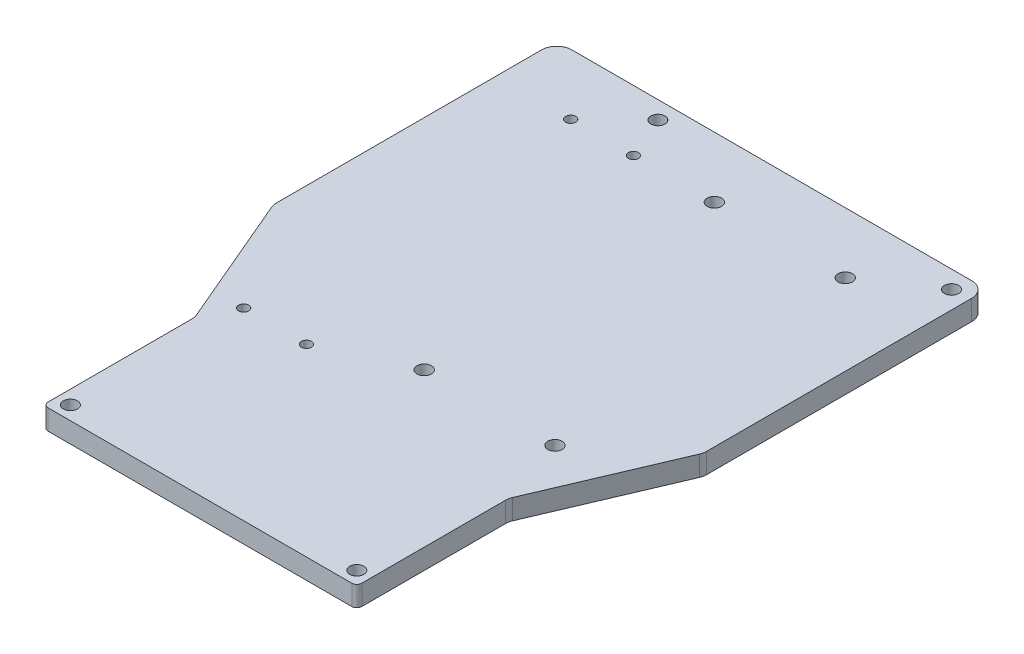
ISO-10303-21;
HEADER;
FILE_DESCRIPTION(('STEP AP214'),'2;1');
FILE_NAME('part.step','',(''),(''),'','','');
FILE_SCHEMA(('AUTOMOTIVE_DESIGN { 1 0 10303 214 1 1 1 1 }'));
ENDSEC;
DATA;
#1=APPLICATION_CONTEXT('core data for automotive mechanical design processes');
#2=APPLICATION_PROTOCOL_DEFINITION('international standard','automotive_design',2000,#1);
#3=PRODUCT_CONTEXT('',#1,'mechanical');
#4=PRODUCT('Part','Part','',(#3));
#5=PRODUCT_RELATED_PRODUCT_CATEGORY('part','',(#4));
#6=PRODUCT_DEFINITION_FORMATION('','',#4);
#7=PRODUCT_DEFINITION_CONTEXT('part definition',#1,'design');
#8=PRODUCT_DEFINITION('design','',#6,#7);
#9=PRODUCT_DEFINITION_SHAPE('','',#8);
#10=(LENGTH_UNIT() NAMED_UNIT(*) SI_UNIT(.MILLI.,.METRE.));
#11=(NAMED_UNIT(*) PLANE_ANGLE_UNIT() SI_UNIT($,.RADIAN.));
#12=(NAMED_UNIT(*) SI_UNIT($,.STERADIAN.) SOLID_ANGLE_UNIT());
#13=UNCERTAINTY_MEASURE_WITH_UNIT(LENGTH_MEASURE(1.E-05),#10,'distance_accuracy_value','');
#14=(GEOMETRIC_REPRESENTATION_CONTEXT(3) GLOBAL_UNCERTAINTY_ASSIGNED_CONTEXT((#13)) GLOBAL_UNIT_ASSIGNED_CONTEXT((#10,
#11,#12)) REPRESENTATION_CONTEXT('',''));
#15=CARTESIAN_POINT('',(0.,0.,0.));
#16=DIRECTION('',(0.,0.,1.));
#17=DIRECTION('',(1.,0.,0.));
#18=AXIS2_PLACEMENT_3D('',#15,#16,#17);
#19=CARTESIAN_POINT('',(39.5,4.,-25.));
#20=DIRECTION('',(0.,-1.,0.));
#21=DIRECTION('',(0.,0.,-1.));
#22=AXIS2_PLACEMENT_3D('',#19,#20,#21);
#23=CYLINDRICAL_SURFACE('',#22,3.);
#24=CARTESIAN_POINT('',(39.5,0.,-25.));
#25=DIRECTION('',(0.,1.,0.));
#26=DIRECTION('',(0.,0.,-1.));
#27=AXIS2_PLACEMENT_3D('',#24,#25,#26);
#28=CIRCLE('',#27,3.);
#29=CARTESIAN_POINT('',(42.5,0.,-25.));
#30=VERTEX_POINT('',#29);
#31=CARTESIAN_POINT('',(39.5,0.,-28.));
#32=VERTEX_POINT('',#31);
#33=EDGE_CURVE('E190',#30,#32,#28,.T.);
#34=ORIENTED_EDGE('',*,*,#33,.T.);
#35=DIRECTION('',(0.,-1.,0.));
#36=VECTOR('',#35,1.);
#37=CARTESIAN_POINT('',(39.5,4.,-28.));
#38=LINE('',#37,#36);
#39=CARTESIAN_POINT('',(39.5,4.,-28.));
#40=VERTEX_POINT('',#39);
#41=EDGE_CURVE('E11',#40,#32,#38,.T.);
#42=ORIENTED_EDGE('',*,*,#41,.F.);
#43=CARTESIAN_POINT('',(39.5,4.,-25.));
#44=DIRECTION('',(0.,1.,0.));
#45=DIRECTION('',(0.,0.,-1.));
#46=AXIS2_PLACEMENT_3D('',#43,#44,#45);
#47=CIRCLE('',#46,3.);
#48=CARTESIAN_POINT('',(42.5,4.,-25.));
#49=VERTEX_POINT('',#48);
#50=EDGE_CURVE('E237',#49,#40,#47,.T.);
#51=ORIENTED_EDGE('',*,*,#50,.F.);
#52=DIRECTION('',(0.,-1.,0.));
#53=VECTOR('',#52,1.);
#54=CARTESIAN_POINT('',(42.5,4.,-25.));
#55=LINE('',#54,#53);
#56=EDGE_CURVE('E186',#49,#30,#55,.T.);
#57=ORIENTED_EDGE('',*,*,#56,.T.);
#58=EDGE_LOOP('',(#34,#42,#51,#57));
#59=FACE_BOUND('',#58,.T.);
#60=ADVANCED_FACE('F41',(#59),#23,.T.);
#61=CARTESIAN_POINT('',(-39.5,4.,-28.));
#62=DIRECTION('',(0.,0.,1.));
#63=DIRECTION('',(1.,0.,0.));
#64=AXIS2_PLACEMENT_3D('',#61,#62,#63);
#65=PLANE('',#64);
#66=DIRECTION('',(-1.,0.,0.));
#67=VECTOR('',#66,1.);
#68=CARTESIAN_POINT('',(-39.5,0.,-28.));
#69=LINE('',#68,#67);
#70=CARTESIAN_POINT('',(-39.5,0.,-28.));
#71=VERTEX_POINT('',#70);
#72=EDGE_CURVE('E194',#32,#71,#69,.T.);
#73=ORIENTED_EDGE('',*,*,#72,.T.);
#74=DIRECTION('',(0.,-1.,0.));
#75=VECTOR('',#74,1.);
#76=CARTESIAN_POINT('',(-39.5,4.,-28.));
#77=LINE('',#76,#75);
#78=CARTESIAN_POINT('',(-39.5,4.,-28.));
#79=VERTEX_POINT('',#78);
#80=EDGE_CURVE('E50',#79,#71,#77,.T.);
#81=ORIENTED_EDGE('',*,*,#80,.F.);
#82=DIRECTION('',(-1.,0.,0.));
#83=VECTOR('',#82,1.);
#84=CARTESIAN_POINT('',(-39.5,4.,-28.));
#85=LINE('',#84,#83);
#86=EDGE_CURVE('E125',#40,#79,#85,.T.);
#87=ORIENTED_EDGE('',*,*,#86,.F.);
#88=ORIENTED_EDGE('',*,*,#41,.T.);
#89=EDGE_LOOP('',(#73,#81,#87,#88));
#90=FACE_BOUND('',#89,.T.);
#91=ADVANCED_FACE('F360',(#90),#65,.F.);
#92=CARTESIAN_POINT('',(-39.5,4.,-25.));
#93=DIRECTION('',(0.,-1.,0.));
#94=DIRECTION('',(0.,0.,-1.));
#95=AXIS2_PLACEMENT_3D('',#92,#93,#94);
#96=CYLINDRICAL_SURFACE('',#95,3.);
#97=CARTESIAN_POINT('',(-39.5,0.,-25.));
#98=DIRECTION('',(0.,1.,0.));
#99=DIRECTION('',(0.,0.,-1.));
#100=AXIS2_PLACEMENT_3D('',#97,#98,#99);
#101=CIRCLE('',#100,3.);
#102=CARTESIAN_POINT('',(-42.5,0.,-25.));
#103=VERTEX_POINT('',#102);
#104=EDGE_CURVE('E198',#71,#103,#101,.T.);
#105=ORIENTED_EDGE('',*,*,#104,.T.);
#106=DIRECTION('',(0.,-1.,0.));
#107=VECTOR('',#106,1.);
#108=CARTESIAN_POINT('',(-42.5,4.,-25.));
#109=LINE('',#108,#107);
#110=CARTESIAN_POINT('',(-42.5,4.,-25.));
#111=VERTEX_POINT('',#110);
#112=EDGE_CURVE('E280',#111,#103,#109,.T.);
#113=ORIENTED_EDGE('',*,*,#112,.F.);
#114=CARTESIAN_POINT('',(-39.5,4.,-25.));
#115=DIRECTION('',(0.,1.,0.));
#116=DIRECTION('',(0.,0.,-1.));
#117=AXIS2_PLACEMENT_3D('',#114,#115,#116);
#118=CIRCLE('',#117,3.);
#119=EDGE_CURVE('E290',#79,#111,#118,.T.);
#120=ORIENTED_EDGE('',*,*,#119,.F.);
#121=ORIENTED_EDGE('',*,*,#80,.T.);
#122=EDGE_LOOP('',(#105,#113,#120,#121));
#123=FACE_BOUND('',#122,.T.);
#124=ADVANCED_FACE('F288',(#123),#96,.T.);
#125=CARTESIAN_POINT('',(-42.5,4.,27.3877231700022));
#126=DIRECTION('',(1.,0.,0.));
#127=DIRECTION('',(0.,0.,-1.));
#128=AXIS2_PLACEMENT_3D('',#125,#126,#127);
#129=PLANE('',#128);
#130=DIRECTION('',(0.,0.,1.));
#131=VECTOR('',#130,1.);
#132=CARTESIAN_POINT('',(-42.5,0.,27.3877231700022));
#133=LINE('',#132,#131);
#134=CARTESIAN_POINT('',(-42.5,0.,27.3877231700022));
#135=VERTEX_POINT('',#134);
#136=EDGE_CURVE('E201',#103,#135,#133,.T.);
#137=ORIENTED_EDGE('',*,*,#136,.T.);
#138=DIRECTION('',(0.,-1.,0.));
#139=VECTOR('',#138,1.);
#140=CARTESIAN_POINT('',(-42.5,4.,27.3877231700022));
#141=LINE('',#140,#139);
#142=CARTESIAN_POINT('',(-42.5,4.,27.3877231700022));
#143=VERTEX_POINT('',#142);
#144=EDGE_CURVE('E276',#143,#135,#141,.T.);
#145=ORIENTED_EDGE('',*,*,#144,.F.);
#146=DIRECTION('',(0.,0.,1.));
#147=VECTOR('',#146,1.);
#148=CARTESIAN_POINT('',(-42.5,4.,27.3877231700022));
#149=LINE('',#148,#147);
#150=EDGE_CURVE('E309',#111,#143,#149,.T.);
#151=ORIENTED_EDGE('',*,*,#150,.F.);
#152=ORIENTED_EDGE('',*,*,#112,.T.);
#153=EDGE_LOOP('',(#137,#145,#151,#152));
#154=FACE_BOUND('',#153,.T.);
#155=ADVANCED_FACE('F299',(#154),#129,.F.);
#156=CARTESIAN_POINT('',(-39.5,4.,27.3877231700022));
#157=DIRECTION('',(0.,-1.,0.));
#158=DIRECTION('',(0.,0.,-1.));
#159=AXIS2_PLACEMENT_3D('',#156,#157,#158);
#160=CYLINDRICAL_SURFACE('',#159,3.);
#161=CARTESIAN_POINT('',(-39.5,0.,27.3877231700022));
#162=DIRECTION('',(0.,1.,0.));
#163=DIRECTION('',(0.,0.,-1.));
#164=AXIS2_PLACEMENT_3D('',#161,#162,#163);
#165=CIRCLE('',#164,3.);
#166=CARTESIAN_POINT('',(-42.2600719369687,0.,28.5633093653778));
#167=VERTEX_POINT('',#166);
#168=EDGE_CURVE('E204',#135,#167,#165,.T.);
#169=ORIENTED_EDGE('',*,*,#168,.T.);
#170=DIRECTION('',(0.,-1.,0.));
#171=VECTOR('',#170,1.);
#172=CARTESIAN_POINT('',(-42.2600719369687,4.,28.5633093653778));
#173=LINE('',#172,#171);
#174=CARTESIAN_POINT('',(-42.2600719369687,4.,28.5633093653778));
#175=VERTEX_POINT('',#174);
#176=EDGE_CURVE('E272',#175,#167,#173,.T.);
#177=ORIENTED_EDGE('',*,*,#176,.F.);
#178=CARTESIAN_POINT('',(-39.5,4.,27.3877231700022));
#179=DIRECTION('',(0.,1.,0.));
#180=DIRECTION('',(0.,0.,-1.));
#181=AXIS2_PLACEMENT_3D('',#178,#179,#180);
#182=CIRCLE('',#181,3.);
#183=EDGE_CURVE('E305',#143,#175,#182,.T.);
#184=ORIENTED_EDGE('',*,*,#183,.F.);
#185=ORIENTED_EDGE('',*,*,#144,.T.);
#186=EDGE_LOOP('',(#169,#177,#184,#185));
#187=FACE_BOUND('',#186,.T.);
#188=ADVANCED_FACE('F303',(#187),#160,.T.);
#189=CARTESIAN_POINT('',(-42.2600719369687,4.,28.5633093653777));
#190=DIRECTION('',(0.92002397898958,0.,-0.391862065125192));
#191=DIRECTION('',(-0.391862065125192,0.,-0.92002397898958));
#192=AXIS2_PLACEMENT_3D('',#189,#190,#191);
#193=PLANE('',#192);
#194=DIRECTION('',(0.391862065125192,0.,0.92002397898958));
#195=VECTOR('',#194,1.);
#196=CARTESIAN_POINT('',(-42.2600719369687,0.,28.5633093653777));
#197=LINE('',#196,#195);
#198=CARTESIAN_POINT('',(-31.2399280630313,0.,54.4366906346222));
#199=VERTEX_POINT('',#198);
#200=EDGE_CURVE('E207',#167,#199,#197,.T.);
#201=ORIENTED_EDGE('',*,*,#200,.T.);
#202=DIRECTION('',(0.,-1.,0.));
#203=VECTOR('',#202,1.);
#204=CARTESIAN_POINT('',(-31.2399280630313,4.,54.4366906346222));
#205=LINE('',#204,#203);
#206=CARTESIAN_POINT('',(-31.2399280630313,4.,54.4366906346222));
#207=VERTEX_POINT('',#206);
#208=EDGE_CURVE('E268',#207,#199,#205,.T.);
#209=ORIENTED_EDGE('',*,*,#208,.F.);
#210=DIRECTION('',(0.391862065125192,0.,0.92002397898958));
#211=VECTOR('',#210,1.);
#212=CARTESIAN_POINT('',(-42.2600719369687,4.,28.5633093653777));
#213=LINE('',#212,#211);
#214=EDGE_CURVE('E308',#175,#207,#213,.T.);
#215=ORIENTED_EDGE('',*,*,#214,.F.);
#216=ORIENTED_EDGE('',*,*,#176,.T.);
#217=EDGE_LOOP('',(#201,#209,#215,#216));
#218=FACE_BOUND('',#217,.T.);
#219=ADVANCED_FACE('F373',(#218),#193,.F.);
#220=CARTESIAN_POINT('',(-34.,4.,55.6122768299978));
#221=DIRECTION('',(0.,-1.,0.));
#222=DIRECTION('',(0.,0.,-1.));
#223=AXIS2_PLACEMENT_3D('',#220,#221,#222);
#224=CYLINDRICAL_SURFACE('',#223,3.);
#225=CARTESIAN_POINT('',(-34.,0.,55.6122768299978));
#226=DIRECTION('',(0.,-1.,0.));
#227=DIRECTION('',(0.,0.,-1.));
#228=AXIS2_PLACEMENT_3D('',#225,#226,#227);
#229=CIRCLE('',#228,3.);
#230=CARTESIAN_POINT('',(-31.,0.,55.6122768299978));
#231=VERTEX_POINT('',#230);
#232=EDGE_CURVE('E210',#199,#231,#229,.T.);
#233=ORIENTED_EDGE('',*,*,#232,.T.);
#234=DIRECTION('',(0.,-1.,0.));
#235=VECTOR('',#234,1.);
#236=CARTESIAN_POINT('',(-31.,4.,55.6122768299978));
#237=LINE('',#236,#235);
#238=CARTESIAN_POINT('',(-31.,4.,55.6122768299978));
#239=VERTEX_POINT('',#238);
#240=EDGE_CURVE('E264',#239,#231,#237,.T.);
#241=ORIENTED_EDGE('',*,*,#240,.F.);
#242=CARTESIAN_POINT('',(-34.,4.,55.6122768299978));
#243=DIRECTION('',(0.,-1.,0.));
#244=DIRECTION('',(0.,0.,-1.));
#245=AXIS2_PLACEMENT_3D('',#242,#243,#244);
#246=CIRCLE('',#245,3.);
#247=EDGE_CURVE('E313',#207,#239,#246,.T.);
#248=ORIENTED_EDGE('',*,*,#247,.F.);
#249=ORIENTED_EDGE('',*,*,#208,.T.);
#250=EDGE_LOOP('',(#233,#241,#248,#249));
#251=FACE_BOUND('',#250,.T.);
#252=ADVANCED_FACE('F376',(#251),#224,.F.);
#253=CARTESIAN_POINT('',(-31.,4.,55.6122768299978));
#254=DIRECTION('',(1.,0.,0.));
#255=DIRECTION('',(0.,0.,-1.));
#256=AXIS2_PLACEMENT_3D('',#253,#254,#255);
#257=PLANE('',#256);
#258=DIRECTION('',(0.,0.,1.));
#259=VECTOR('',#258,1.);
#260=CARTESIAN_POINT('',(-31.,0.,55.6122768299978));
#261=LINE('',#260,#259);
#262=CARTESIAN_POINT('',(-31.,0.,84.));
#263=VERTEX_POINT('',#262);
#264=EDGE_CURVE('E213',#231,#263,#261,.T.);
#265=ORIENTED_EDGE('',*,*,#264,.T.);
#266=DIRECTION('',(0.,-1.,0.));
#267=VECTOR('',#266,1.);
#268=CARTESIAN_POINT('',(-31.,4.,84.));
#269=LINE('',#268,#267);
#270=CARTESIAN_POINT('',(-31.,4.,84.));
#271=VERTEX_POINT('',#270);
#272=EDGE_CURVE('E260',#271,#263,#269,.T.);
#273=ORIENTED_EDGE('',*,*,#272,.F.);
#274=DIRECTION('',(0.,0.,1.));
#275=VECTOR('',#274,1.);
#276=CARTESIAN_POINT('',(-31.,4.,55.6122768299978));
#277=LINE('',#276,#275);
#278=EDGE_CURVE('E320',#239,#271,#277,.T.);
#279=ORIENTED_EDGE('',*,*,#278,.F.);
#280=ORIENTED_EDGE('',*,*,#240,.T.);
#281=EDGE_LOOP('',(#265,#273,#279,#280));
#282=FACE_BOUND('',#281,.T.);
#283=ADVANCED_FACE('F380',(#282),#257,.F.);
#284=CARTESIAN_POINT('',(-30.,4.,84.));
#285=DIRECTION('',(0.,-1.,0.));
#286=DIRECTION('',(0.,0.,-1.));
#287=AXIS2_PLACEMENT_3D('',#284,#285,#286);
#288=CYLINDRICAL_SURFACE('',#287,1.);
#289=CARTESIAN_POINT('',(-30.,0.,84.));
#290=DIRECTION('',(0.,1.,0.));
#291=DIRECTION('',(0.,0.,-1.));
#292=AXIS2_PLACEMENT_3D('',#289,#290,#291);
#293=CIRCLE('',#292,1.);
#294=CARTESIAN_POINT('',(-30.,0.,85.));
#295=VERTEX_POINT('',#294);
#296=EDGE_CURVE('E216',#263,#295,#293,.T.);
#297=ORIENTED_EDGE('',*,*,#296,.T.);
#298=DIRECTION('',(0.,-1.,0.));
#299=VECTOR('',#298,1.);
#300=CARTESIAN_POINT('',(-30.,4.,85.));
#301=LINE('',#300,#299);
#302=CARTESIAN_POINT('',(-30.,4.,85.));
#303=VERTEX_POINT('',#302);
#304=EDGE_CURVE('E256',#303,#295,#301,.T.);
#305=ORIENTED_EDGE('',*,*,#304,.F.);
#306=CARTESIAN_POINT('',(-30.,4.,84.));
#307=DIRECTION('',(0.,1.,0.));
#308=DIRECTION('',(0.,0.,-1.));
#309=AXIS2_PLACEMENT_3D('',#306,#307,#308);
#310=CIRCLE('',#309,1.);
#311=EDGE_CURVE('E323',#271,#303,#310,.T.);
#312=ORIENTED_EDGE('',*,*,#311,.F.);
#313=ORIENTED_EDGE('',*,*,#272,.T.);
#314=EDGE_LOOP('',(#297,#305,#312,#313));
#315=FACE_BOUND('',#314,.T.);
#316=ADVANCED_FACE('F384',(#315),#288,.T.);
#317=CARTESIAN_POINT('',(-30.,4.,85.));
#318=DIRECTION('',(0.,0.,-1.));
#319=DIRECTION('',(-1.,0.,0.));
#320=AXIS2_PLACEMENT_3D('',#317,#318,#319);
#321=PLANE('',#320);
#322=DIRECTION('',(1.,0.,0.));
#323=VECTOR('',#322,1.);
#324=CARTESIAN_POINT('',(-30.,0.,85.));
#325=LINE('',#324,#323);
#326=CARTESIAN_POINT('',(30.,0.,85.));
#327=VERTEX_POINT('',#326);
#328=EDGE_CURVE('E219',#295,#327,#325,.T.);
#329=ORIENTED_EDGE('',*,*,#328,.T.);
#330=DIRECTION('',(0.,-1.,0.));
#331=VECTOR('',#330,1.);
#332=CARTESIAN_POINT('',(30.,4.,85.));
#333=LINE('',#332,#331);
#334=CARTESIAN_POINT('',(30.,4.,85.));
#335=VERTEX_POINT('',#334);
#336=EDGE_CURVE('E252',#335,#327,#333,.T.);
#337=ORIENTED_EDGE('',*,*,#336,.F.);
#338=DIRECTION('',(1.,0.,0.));
#339=VECTOR('',#338,1.);
#340=CARTESIAN_POINT('',(-30.,4.,85.));
#341=LINE('',#340,#339);
#342=EDGE_CURVE('E326',#303,#335,#341,.T.);
#343=ORIENTED_EDGE('',*,*,#342,.F.);
#344=ORIENTED_EDGE('',*,*,#304,.T.);
#345=EDGE_LOOP('',(#329,#337,#343,#344));
#346=FACE_BOUND('',#345,.T.);
#347=ADVANCED_FACE('F388',(#346),#321,.F.);
#348=CARTESIAN_POINT('',(30.,4.,84.));
#349=DIRECTION('',(0.,-1.,0.));
#350=DIRECTION('',(0.,0.,-1.));
#351=AXIS2_PLACEMENT_3D('',#348,#349,#350);
#352=CYLINDRICAL_SURFACE('',#351,1.);
#353=CARTESIAN_POINT('',(30.,0.,84.));
#354=DIRECTION('',(0.,1.,0.));
#355=DIRECTION('',(0.,0.,1.));
#356=AXIS2_PLACEMENT_3D('',#353,#354,#355);
#357=CIRCLE('',#356,1.);
#358=CARTESIAN_POINT('',(31.,0.,84.));
#359=VERTEX_POINT('',#358);
#360=EDGE_CURVE('E222',#327,#359,#357,.T.);
#361=ORIENTED_EDGE('',*,*,#360,.T.);
#362=DIRECTION('',(0.,-1.,0.));
#363=VECTOR('',#362,1.);
#364=CARTESIAN_POINT('',(31.,4.,84.));
#365=LINE('',#364,#363);
#366=CARTESIAN_POINT('',(31.,4.,84.));
#367=VERTEX_POINT('',#366);
#368=EDGE_CURVE('E248',#367,#359,#365,.T.);
#369=ORIENTED_EDGE('',*,*,#368,.F.);
#370=CARTESIAN_POINT('',(30.,4.,84.));
#371=DIRECTION('',(0.,1.,0.));
#372=DIRECTION('',(0.,0.,1.));
#373=AXIS2_PLACEMENT_3D('',#370,#371,#372);
#374=CIRCLE('',#373,1.);
#375=EDGE_CURVE('E329',#335,#367,#374,.T.);
#376=ORIENTED_EDGE('',*,*,#375,.F.);
#377=ORIENTED_EDGE('',*,*,#336,.T.);
#378=EDGE_LOOP('',(#361,#369,#376,#377));
#379=FACE_BOUND('',#378,.T.);
#380=ADVANCED_FACE('F392',(#379),#352,.T.);
#381=CARTESIAN_POINT('',(31.,4.,55.6122768299978));
#382=DIRECTION('',(-1.,0.,0.));
#383=DIRECTION('',(0.,0.,1.));
#384=AXIS2_PLACEMENT_3D('',#381,#382,#383);
#385=PLANE('',#384);
#386=DIRECTION('',(0.,0.,-1.));
#387=VECTOR('',#386,1.);
#388=CARTESIAN_POINT('',(31.,0.,55.6122768299978));
#389=LINE('',#388,#387);
#390=CARTESIAN_POINT('',(31.,0.,55.6122768299978));
#391=VERTEX_POINT('',#390);
#392=EDGE_CURVE('E225',#359,#391,#389,.T.);
#393=ORIENTED_EDGE('',*,*,#392,.T.);
#394=DIRECTION('',(0.,-1.,0.));
#395=VECTOR('',#394,1.);
#396=CARTESIAN_POINT('',(31.,4.,55.6122768299978));
#397=LINE('',#396,#395);
#398=CARTESIAN_POINT('',(31.,4.,55.6122768299978));
#399=VERTEX_POINT('',#398);
#400=EDGE_CURVE('E244',#399,#391,#397,.T.);
#401=ORIENTED_EDGE('',*,*,#400,.F.);
#402=DIRECTION('',(0.,0.,-1.));
#403=VECTOR('',#402,1.);
#404=CARTESIAN_POINT('',(31.,4.,55.6122768299978));
#405=LINE('',#404,#403);
#406=EDGE_CURVE('E332',#367,#399,#405,.T.);
#407=ORIENTED_EDGE('',*,*,#406,.F.);
#408=ORIENTED_EDGE('',*,*,#368,.T.);
#409=EDGE_LOOP('',(#393,#401,#407,#408));
#410=FACE_BOUND('',#409,.T.);
#411=ADVANCED_FACE('F340',(#410),#385,.F.);
#412=CARTESIAN_POINT('',(34.,4.,55.6122768299978));
#413=DIRECTION('',(0.,-1.,0.));
#414=DIRECTION('',(0.,0.,-1.));
#415=AXIS2_PLACEMENT_3D('',#412,#413,#414);
#416=CYLINDRICAL_SURFACE('',#415,3.);
#417=CARTESIAN_POINT('',(34.,0.,55.6122768299978));
#418=DIRECTION('',(0.,-1.,0.));
#419=DIRECTION('',(0.,0.,1.));
#420=AXIS2_PLACEMENT_3D('',#417,#418,#419);
#421=CIRCLE('',#420,3.);
#422=CARTESIAN_POINT('',(31.2399280630313,0.,54.4366906346222));
#423=VERTEX_POINT('',#422);
#424=EDGE_CURVE('E228',#391,#423,#421,.T.);
#425=ORIENTED_EDGE('',*,*,#424,.T.);
#426=DIRECTION('',(0.,-1.,0.));
#427=VECTOR('',#426,1.);
#428=CARTESIAN_POINT('',(31.2399280630313,4.,54.4366906346222));
#429=LINE('',#428,#427);
#430=CARTESIAN_POINT('',(31.2399280630313,4.,54.4366906346222));
#431=VERTEX_POINT('',#430);
#432=EDGE_CURVE('E179',#431,#423,#429,.T.);
#433=ORIENTED_EDGE('',*,*,#432,.F.);
#434=CARTESIAN_POINT('',(34.,4.,55.6122768299978));
#435=DIRECTION('',(0.,-1.,0.));
#436=DIRECTION('',(0.,0.,1.));
#437=AXIS2_PLACEMENT_3D('',#434,#435,#436);
#438=CIRCLE('',#437,3.);
#439=EDGE_CURVE('E168',#399,#431,#438,.T.);
#440=ORIENTED_EDGE('',*,*,#439,.F.);
#441=ORIENTED_EDGE('',*,*,#400,.T.);
#442=EDGE_LOOP('',(#425,#433,#440,#441));
#443=FACE_BOUND('',#442,.T.);
#444=ADVANCED_FACE('F344',(#443),#416,.F.);
#445=CARTESIAN_POINT('',(42.2600719369687,4.,28.5633093653777));
#446=DIRECTION('',(-0.92002397898958,0.,-0.391862065125192));
#447=DIRECTION('',(-0.391862065125192,0.,0.92002397898958));
#448=AXIS2_PLACEMENT_3D('',#445,#446,#447);
#449=PLANE('',#448);
#450=DIRECTION('',(0.391862065125192,0.,-0.92002397898958));
#451=VECTOR('',#450,1.);
#452=CARTESIAN_POINT('',(42.2600719369687,0.,28.5633093653777));
#453=LINE('',#452,#451);
#454=CARTESIAN_POINT('',(42.2600719369687,0.,28.5633093653777));
#455=VERTEX_POINT('',#454);
#456=EDGE_CURVE('E177',#423,#455,#453,.T.);
#457=ORIENTED_EDGE('',*,*,#456,.T.);
#458=DIRECTION('',(0.,-1.,0.));
#459=VECTOR('',#458,1.);
#460=CARTESIAN_POINT('',(42.2600719369687,4.,28.5633093653777));
#461=LINE('',#460,#459);
#462=CARTESIAN_POINT('',(42.2600719369687,4.,28.5633093653777));
#463=VERTEX_POINT('',#462);
#464=EDGE_CURVE('E174',#463,#455,#461,.T.);
#465=ORIENTED_EDGE('',*,*,#464,.F.);
#466=DIRECTION('',(0.391862065125192,0.,-0.92002397898958));
#467=VECTOR('',#466,1.);
#468=CARTESIAN_POINT('',(42.2600719369687,4.,28.5633093653777));
#469=LINE('',#468,#467);
#470=EDGE_CURVE('E162',#431,#463,#469,.T.);
#471=ORIENTED_EDGE('',*,*,#470,.F.);
#472=ORIENTED_EDGE('',*,*,#432,.T.);
#473=EDGE_LOOP('',(#457,#465,#471,#472));
#474=FACE_BOUND('',#473,.T.);
#475=ADVANCED_FACE('F175',(#474),#449,.F.);
#476=CARTESIAN_POINT('',(39.5,4.,27.3877231700022));
#477=DIRECTION('',(0.,-1.,0.));
#478=DIRECTION('',(0.,0.,-1.));
#479=AXIS2_PLACEMENT_3D('',#476,#477,#478);
#480=CYLINDRICAL_SURFACE('',#479,3.);
#481=CARTESIAN_POINT('',(39.5,0.,27.3877231700022));
#482=DIRECTION('',(0.,1.,0.));
#483=DIRECTION('',(0.,0.,1.));
#484=AXIS2_PLACEMENT_3D('',#481,#482,#483);
#485=CIRCLE('',#484,3.);
#486=CARTESIAN_POINT('',(42.5,0.,27.3877231700022));
#487=VERTEX_POINT('',#486);
#488=EDGE_CURVE('E111',#455,#487,#485,.T.);
#489=ORIENTED_EDGE('',*,*,#488,.T.);
#490=DIRECTION('',(0.,-1.,0.));
#491=VECTOR('',#490,1.);
#492=CARTESIAN_POINT('',(42.5,4.,27.3877231700022));
#493=LINE('',#492,#491);
#494=CARTESIAN_POINT('',(42.5,4.,27.3877231700022));
#495=VERTEX_POINT('',#494);
#496=EDGE_CURVE('E180',#495,#487,#493,.T.);
#497=ORIENTED_EDGE('',*,*,#496,.F.);
#498=CARTESIAN_POINT('',(39.5,4.,27.3877231700022));
#499=DIRECTION('',(0.,1.,0.));
#500=DIRECTION('',(0.,0.,1.));
#501=AXIS2_PLACEMENT_3D('',#498,#499,#500);
#502=CIRCLE('',#501,3.);
#503=EDGE_CURVE('E166',#463,#495,#502,.T.);
#504=ORIENTED_EDGE('',*,*,#503,.F.);
#505=ORIENTED_EDGE('',*,*,#464,.T.);
#506=EDGE_LOOP('',(#489,#497,#504,#505));
#507=FACE_BOUND('',#506,.T.);
#508=ADVANCED_FACE('F182',(#507),#480,.T.);
#509=CARTESIAN_POINT('',(42.5,4.,27.3877231700022));
#510=DIRECTION('',(-1.,0.,0.));
#511=DIRECTION('',(0.,0.,1.));
#512=AXIS2_PLACEMENT_3D('',#509,#510,#511);
#513=PLANE('',#512);
#514=DIRECTION('',(0.,0.,-1.));
#515=VECTOR('',#514,1.);
#516=CARTESIAN_POINT('',(42.5,0.,27.3877231700022));
#517=LINE('',#516,#515);
#518=EDGE_CURVE('E117',#487,#30,#517,.T.);
#519=ORIENTED_EDGE('',*,*,#518,.T.);
#520=ORIENTED_EDGE('',*,*,#56,.F.);
#521=DIRECTION('',(0.,0.,-1.));
#522=VECTOR('',#521,1.);
#523=CARTESIAN_POINT('',(42.5,4.,27.3877231700022));
#524=LINE('',#523,#522);
#525=EDGE_CURVE('E58',#495,#49,#524,.T.);
#526=ORIENTED_EDGE('',*,*,#525,.F.);
#527=ORIENTED_EDGE('',*,*,#496,.T.);
#528=EDGE_LOOP('',(#519,#520,#526,#527));
#529=FACE_BOUND('',#528,.T.);
#530=ADVANCED_FACE('F348',(#529),#513,.F.);
#531=CARTESIAN_POINT('',(39.5,4.,-25.));
#532=DIRECTION('',(0.,-1.,0.));
#533=DIRECTION('',(0.,0.,-1.));
#534=AXIS2_PLACEMENT_3D('',#531,#532,#533);
#535=PLANE('',#534);
#536=CARTESIAN_POINT('',(39.,4.,-24.5));
#537=DIRECTION('',(0.,1.,0.));
#538=DIRECTION('',(0.,0.,1.));
#539=AXIS2_PLACEMENT_3D('',#536,#537,#538);
#540=CIRCLE('',#539,1.4);
#541=CARTESIAN_POINT('',(39.,4.,-23.1));
#542=VERTEX_POINT('',#541);
#543=EDGE_CURVE('E672',#542,#542,#540,.T.);
#544=ORIENTED_EDGE('',*,*,#543,.F.);
#545=EDGE_LOOP('',(#544));
#546=FACE_BOUND('',#545,.T.);
#547=CARTESIAN_POINT('',(-15.35,4.,48.6));
#548=DIRECTION('',(0.,1.,0.));
#549=DIRECTION('',(0.,0.,1.));
#550=AXIS2_PLACEMENT_3D('',#547,#548,#549);
#551=CIRCLE('',#550,0.999999999999998);
#552=CARTESIAN_POINT('',(-15.35,4.,49.6));
#553=VERTEX_POINT('',#552);
#554=EDGE_CURVE('E704',#553,#553,#551,.T.);
#555=ORIENTED_EDGE('',*,*,#554,.F.);
#556=EDGE_LOOP('',(#555));
#557=FACE_BOUND('',#556,.T.);
#558=CARTESIAN_POINT('',(-27.75,4.,48.6));
#559=DIRECTION('',(0.,1.,0.));
#560=DIRECTION('',(0.,0.,1.));
#561=AXIS2_PLACEMENT_3D('',#558,#559,#560);
#562=CIRCLE('',#561,0.999999999999998);
#563=CARTESIAN_POINT('',(-27.75,4.,49.6));
#564=VERTEX_POINT('',#563);
#565=EDGE_CURVE('E696',#564,#564,#562,.T.);
#566=ORIENTED_EDGE('',*,*,#565,.F.);
#567=EDGE_LOOP('',(#566));
#568=FACE_BOUND('',#567,.T.);
#569=CARTESIAN_POINT('',(-27.75,4.,-16.));
#570=DIRECTION('',(0.,1.,0.));
#571=DIRECTION('',(0.,0.,1.));
#572=AXIS2_PLACEMENT_3D('',#569,#570,#571);
#573=CIRCLE('',#572,0.999999999999998);
#574=CARTESIAN_POINT('',(-27.75,4.,-15.));
#575=VERTEX_POINT('',#574);
#576=EDGE_CURVE('E688',#575,#575,#573,.T.);
#577=ORIENTED_EDGE('',*,*,#576,.F.);
#578=EDGE_LOOP('',(#577));
#579=FACE_BOUND('',#578,.T.);
#580=CARTESIAN_POINT('',(-28.3,4.,82.3));
#581=DIRECTION('',(0.,1.,0.));
#582=DIRECTION('',(0.,0.,1.));
#583=AXIS2_PLACEMENT_3D('',#580,#581,#582);
#584=CIRCLE('',#583,1.4);
#585=CARTESIAN_POINT('',(-28.3,4.,83.7));
#586=VERTEX_POINT('',#585);
#587=EDGE_CURVE('E712',#586,#586,#584,.T.);
#588=ORIENTED_EDGE('',*,*,#587,.F.);
#589=EDGE_LOOP('',(#588));
#590=FACE_BOUND('',#589,.T.);
#591=CARTESIAN_POINT('',(-15.35,4.,-16.));
#592=DIRECTION('',(0.,1.,0.));
#593=DIRECTION('',(0.,0.,1.));
#594=AXIS2_PLACEMENT_3D('',#591,#592,#593);
#595=CIRCLE('',#594,0.999999999999998);
#596=CARTESIAN_POINT('',(-15.35,4.,-15.));
#597=VERTEX_POINT('',#596);
#598=EDGE_CURVE('E745',#597,#597,#595,.T.);
#599=ORIENTED_EDGE('',*,*,#598,.F.);
#600=EDGE_LOOP('',(#599));
#601=FACE_BOUND('',#600,.T.);
#602=CARTESIAN_POINT('',(26.5,4.,41.35));
#603=DIRECTION('',(0.,1.,0.));
#604=DIRECTION('',(0.,0.,1.));
#605=AXIS2_PLACEMENT_3D('',#602,#603,#604);
#606=CIRCLE('',#605,1.425);
#607=CARTESIAN_POINT('',(26.5,4.,42.775));
#608=VERTEX_POINT('',#607);
#609=EDGE_CURVE('E744',#608,#608,#606,.T.);
#610=ORIENTED_EDGE('',*,*,#609,.F.);
#611=EDGE_LOOP('',(#610));
#612=FACE_BOUND('',#611,.T.);
#613=CARTESIAN_POINT('',(-19.,4.,-24.5));
#614=DIRECTION('',(0.,1.,0.));
#615=DIRECTION('',(0.,0.,1.));
#616=AXIS2_PLACEMENT_3D('',#613,#614,#615);
#617=CIRCLE('',#616,1.4);
#618=CARTESIAN_POINT('',(-19.,4.,-23.1));
#619=VERTEX_POINT('',#618);
#620=EDGE_CURVE('E680',#619,#619,#617,.T.);
#621=ORIENTED_EDGE('',*,*,#620,.F.);
#622=EDGE_LOOP('',(#621));
#623=FACE_BOUND('',#622,.T.);
#624=CARTESIAN_POINT('',(28.3,4.,82.3));
#625=DIRECTION('',(0.,1.,0.));
#626=DIRECTION('',(0.,0.,1.));
#627=AXIS2_PLACEMENT_3D('',#624,#625,#626);
#628=CIRCLE('',#627,1.4);
#629=CARTESIAN_POINT('',(28.3,4.,83.7));
#630=VERTEX_POINT('',#629);
#631=EDGE_CURVE('E713',#630,#630,#628,.T.);
#632=ORIENTED_EDGE('',*,*,#631,.F.);
#633=EDGE_LOOP('',(#632));
#634=FACE_BOUND('',#633,.T.);
#635=CARTESIAN_POINT('',(26.5,4.,-16.));
#636=DIRECTION('',(0.,1.,0.));
#637=DIRECTION('',(0.,0.,1.));
#638=AXIS2_PLACEMENT_3D('',#635,#636,#637);
#639=CIRCLE('',#638,1.425);
#640=CARTESIAN_POINT('',(26.5,4.,-14.575));
#641=VERTEX_POINT('',#640);
#642=EDGE_CURVE('E721',#641,#641,#639,.T.);
#643=ORIENTED_EDGE('',*,*,#642,.F.);
#644=EDGE_LOOP('',(#643));
#645=FACE_BOUND('',#644,.T.);
#646=CARTESIAN_POINT('',(0.649999999999998,4.,-16.));
#647=DIRECTION('',(0.,1.,0.));
#648=DIRECTION('',(0.,0.,1.));
#649=AXIS2_PLACEMENT_3D('',#646,#647,#648);
#650=CIRCLE('',#649,1.42499999999999);
#651=CARTESIAN_POINT('',(0.649999999999998,4.,-14.575));
#652=VERTEX_POINT('',#651);
#653=EDGE_CURVE('E729',#652,#652,#650,.T.);
#654=ORIENTED_EDGE('',*,*,#653,.F.);
#655=EDGE_LOOP('',(#654));
#656=FACE_BOUND('',#655,.T.);
#657=CARTESIAN_POINT('',(0.649999999999998,4.,41.35));
#658=DIRECTION('',(0.,1.,0.));
#659=DIRECTION('',(0.,0.,1.));
#660=AXIS2_PLACEMENT_3D('',#657,#658,#659);
#661=CIRCLE('',#660,1.425);
#662=CARTESIAN_POINT('',(0.649999999999998,4.,42.775));
#663=VERTEX_POINT('',#662);
#664=EDGE_CURVE('E687',#663,#663,#661,.T.);
#665=ORIENTED_EDGE('',*,*,#664,.F.);
#666=EDGE_LOOP('',(#665));
#667=FACE_BOUND('',#666,.T.);
#668=ORIENTED_EDGE('',*,*,#50,.T.);
#669=ORIENTED_EDGE('',*,*,#86,.T.);
#670=ORIENTED_EDGE('',*,*,#119,.T.);
#671=ORIENTED_EDGE('',*,*,#150,.T.);
#672=ORIENTED_EDGE('',*,*,#183,.T.);
#673=ORIENTED_EDGE('',*,*,#214,.T.);
#674=ORIENTED_EDGE('',*,*,#247,.T.);
#675=ORIENTED_EDGE('',*,*,#278,.T.);
#676=ORIENTED_EDGE('',*,*,#311,.T.);
#677=ORIENTED_EDGE('',*,*,#342,.T.);
#678=ORIENTED_EDGE('',*,*,#375,.T.);
#679=ORIENTED_EDGE('',*,*,#406,.T.);
#680=ORIENTED_EDGE('',*,*,#439,.T.);
#681=ORIENTED_EDGE('',*,*,#470,.T.);
#682=ORIENTED_EDGE('',*,*,#503,.T.);
#683=ORIENTED_EDGE('',*,*,#525,.T.);
#684=EDGE_LOOP('',(#668,#669,#670,#671,#672,#673,#674,#675,#676,#677,#678,#679,#680,#681,#682,#683));
#685=FACE_BOUND('',#684,.T.);
#686=ADVANCED_FACE('F164',(#546,#557,#568,#579,#590,#601,#612,#623,#634,#645,#656,#667,#685),
#535,.F.);
#687=CARTESIAN_POINT('',(39.5,0.,-25.));
#688=DIRECTION('',(0.,-1.,0.));
#689=DIRECTION('',(0.,0.,-1.));
#690=AXIS2_PLACEMENT_3D('',#687,#688,#689);
#691=PLANE('',#690);
#692=CARTESIAN_POINT('',(39.,0.,-24.5));
#693=DIRECTION('',(0.,1.,0.));
#694=DIRECTION('',(0.,0.,1.));
#695=AXIS2_PLACEMENT_3D('',#692,#693,#694);
#696=CIRCLE('',#695,1.4);
#697=CARTESIAN_POINT('',(39.,0.,-23.1));
#698=VERTEX_POINT('',#697);
#699=EDGE_CURVE('E195',#698,#698,#696,.T.);
#700=ORIENTED_EDGE('',*,*,#699,.T.);
#701=EDGE_LOOP('',(#700));
#702=FACE_BOUND('',#701,.T.);
#703=CARTESIAN_POINT('',(-15.35,0.,48.6));
#704=DIRECTION('',(0.,1.,0.));
#705=DIRECTION('',(0.,0.,1.));
#706=AXIS2_PLACEMENT_3D('',#703,#704,#705);
#707=CIRCLE('',#706,0.999999999999998);
#708=CARTESIAN_POINT('',(-15.35,0.,49.6));
#709=VERTEX_POINT('',#708);
#710=EDGE_CURVE('E700',#709,#709,#707,.T.);
#711=ORIENTED_EDGE('',*,*,#710,.T.);
#712=EDGE_LOOP('',(#711));
#713=FACE_BOUND('',#712,.T.);
#714=CARTESIAN_POINT('',(-27.75,0.,48.6));
#715=DIRECTION('',(0.,1.,0.));
#716=DIRECTION('',(0.,0.,1.));
#717=AXIS2_PLACEMENT_3D('',#714,#715,#716);
#718=CIRCLE('',#717,0.999999999999998);
#719=CARTESIAN_POINT('',(-27.75,0.,49.6));
#720=VERTEX_POINT('',#719);
#721=EDGE_CURVE('E692',#720,#720,#718,.T.);
#722=ORIENTED_EDGE('',*,*,#721,.T.);
#723=EDGE_LOOP('',(#722));
#724=FACE_BOUND('',#723,.T.);
#725=CARTESIAN_POINT('',(-27.75,0.,-16.));
#726=DIRECTION('',(0.,1.,0.));
#727=DIRECTION('',(0.,0.,1.));
#728=AXIS2_PLACEMENT_3D('',#725,#726,#727);
#729=CIRCLE('',#728,0.999999999999998);
#730=CARTESIAN_POINT('',(-27.75,0.,-15.));
#731=VERTEX_POINT('',#730);
#732=EDGE_CURVE('E683',#731,#731,#729,.T.);
#733=ORIENTED_EDGE('',*,*,#732,.T.);
#734=EDGE_LOOP('',(#733));
#735=FACE_BOUND('',#734,.T.);
#736=CARTESIAN_POINT('',(-28.3,0.,82.3));
#737=DIRECTION('',(0.,1.,0.));
#738=DIRECTION('',(0.,0.,1.));
#739=AXIS2_PLACEMENT_3D('',#736,#737,#738);
#740=CIRCLE('',#739,1.4);
#741=CARTESIAN_POINT('',(-28.3,0.,83.7));
#742=VERTEX_POINT('',#741);
#743=EDGE_CURVE('E749',#742,#742,#740,.T.);
#744=ORIENTED_EDGE('',*,*,#743,.T.);
#745=EDGE_LOOP('',(#744));
#746=FACE_BOUND('',#745,.T.);
#747=CARTESIAN_POINT('',(-15.35,0.,-16.));
#748=DIRECTION('',(0.,1.,0.));
#749=DIRECTION('',(0.,0.,1.));
#750=AXIS2_PLACEMENT_3D('',#747,#748,#749);
#751=CIRCLE('',#750,0.999999999999998);
#752=CARTESIAN_POINT('',(-15.35,0.,-15.));
#753=VERTEX_POINT('',#752);
#754=EDGE_CURVE('E740',#753,#753,#751,.T.);
#755=ORIENTED_EDGE('',*,*,#754,.T.);
#756=EDGE_LOOP('',(#755));
#757=FACE_BOUND('',#756,.T.);
#758=CARTESIAN_POINT('',(26.5,0.,41.35));
#759=DIRECTION('',(0.,1.,0.));
#760=DIRECTION('',(0.,0.,1.));
#761=AXIS2_PLACEMENT_3D('',#758,#759,#760);
#762=CIRCLE('',#761,1.425);
#763=CARTESIAN_POINT('',(26.5,0.,42.775));
#764=VERTEX_POINT('',#763);
#765=EDGE_CURVE('E759',#764,#764,#762,.T.);
#766=ORIENTED_EDGE('',*,*,#765,.T.);
#767=EDGE_LOOP('',(#766));
#768=FACE_BOUND('',#767,.T.);
#769=CARTESIAN_POINT('',(-19.,0.,-24.5));
#770=DIRECTION('',(0.,1.,0.));
#771=DIRECTION('',(0.,0.,1.));
#772=AXIS2_PLACEMENT_3D('',#769,#770,#771);
#773=CIRCLE('',#772,1.4);
#774=CARTESIAN_POINT('',(-19.,0.,-23.1));
#775=VERTEX_POINT('',#774);
#776=EDGE_CURVE('E674',#775,#775,#773,.T.);
#777=ORIENTED_EDGE('',*,*,#776,.T.);
#778=EDGE_LOOP('',(#777));
#779=FACE_BOUND('',#778,.T.);
#780=CARTESIAN_POINT('',(28.3,0.,82.3));
#781=DIRECTION('',(0.,1.,0.));
#782=DIRECTION('',(0.,0.,1.));
#783=AXIS2_PLACEMENT_3D('',#780,#781,#782);
#784=CIRCLE('',#783,1.4);
#785=CARTESIAN_POINT('',(28.3,0.,83.7));
#786=VERTEX_POINT('',#785);
#787=EDGE_CURVE('E708',#786,#786,#784,.T.);
#788=ORIENTED_EDGE('',*,*,#787,.T.);
#789=EDGE_LOOP('',(#788));
#790=FACE_BOUND('',#789,.T.);
#791=CARTESIAN_POINT('',(26.5,0.,-16.));
#792=DIRECTION('',(0.,1.,0.));
#793=DIRECTION('',(0.,0.,1.));
#794=AXIS2_PLACEMENT_3D('',#791,#792,#793);
#795=CIRCLE('',#794,1.425);
#796=CARTESIAN_POINT('',(26.5,0.,-14.575));
#797=VERTEX_POINT('',#796);
#798=EDGE_CURVE('E717',#797,#797,#795,.T.);
#799=ORIENTED_EDGE('',*,*,#798,.T.);
#800=EDGE_LOOP('',(#799));
#801=FACE_BOUND('',#800,.T.);
#802=CARTESIAN_POINT('',(0.649999999999998,0.,-16.));
#803=DIRECTION('',(0.,1.,0.));
#804=DIRECTION('',(0.,0.,1.));
#805=AXIS2_PLACEMENT_3D('',#802,#803,#804);
#806=CIRCLE('',#805,1.42499999999999);
#807=CARTESIAN_POINT('',(0.649999999999998,0.,-14.575));
#808=VERTEX_POINT('',#807);
#809=EDGE_CURVE('E725',#808,#808,#806,.T.);
#810=ORIENTED_EDGE('',*,*,#809,.T.);
#811=EDGE_LOOP('',(#810));
#812=FACE_BOUND('',#811,.T.);
#813=CARTESIAN_POINT('',(0.649999999999998,0.,41.35));
#814=DIRECTION('',(0.,1.,0.));
#815=DIRECTION('',(0.,0.,1.));
#816=AXIS2_PLACEMENT_3D('',#813,#814,#815);
#817=CIRCLE('',#816,1.425);
#818=CARTESIAN_POINT('',(0.649999999999998,0.,42.775));
#819=VERTEX_POINT('',#818);
#820=EDGE_CURVE('E733',#819,#819,#817,.T.);
#821=ORIENTED_EDGE('',*,*,#820,.T.);
#822=EDGE_LOOP('',(#821));
#823=FACE_BOUND('',#822,.T.);
#824=ORIENTED_EDGE('',*,*,#33,.F.);
#825=ORIENTED_EDGE('',*,*,#518,.F.);
#826=ORIENTED_EDGE('',*,*,#488,.F.);
#827=ORIENTED_EDGE('',*,*,#456,.F.);
#828=ORIENTED_EDGE('',*,*,#424,.F.);
#829=ORIENTED_EDGE('',*,*,#392,.F.);
#830=ORIENTED_EDGE('',*,*,#360,.F.);
#831=ORIENTED_EDGE('',*,*,#328,.F.);
#832=ORIENTED_EDGE('',*,*,#296,.F.);
#833=ORIENTED_EDGE('',*,*,#264,.F.);
#834=ORIENTED_EDGE('',*,*,#232,.F.);
#835=ORIENTED_EDGE('',*,*,#200,.F.);
#836=ORIENTED_EDGE('',*,*,#168,.F.);
#837=ORIENTED_EDGE('',*,*,#136,.F.);
#838=ORIENTED_EDGE('',*,*,#104,.F.);
#839=ORIENTED_EDGE('',*,*,#72,.F.);
#840=EDGE_LOOP('',(#824,#825,#826,#827,#828,#829,#830,#831,#832,#833,#834,#835,#836,#837,#838,#839));
#841=FACE_BOUND('',#840,.T.);
#842=ADVANCED_FACE('F294',(#702,#713,#724,#735,#746,#757,#768,#779,#790,#801,#812,#823,#841),
#691,.T.);
#843=CARTESIAN_POINT('',(0.649999999999998,0.,41.35));
#844=DIRECTION('',(0.,1.,0.));
#845=DIRECTION('',(0.,0.,1.));
#846=AXIS2_PLACEMENT_3D('',#843,#844,#845);
#847=CYLINDRICAL_SURFACE('',#846,1.425);
#848=ORIENTED_EDGE('',*,*,#820,.F.);
#849=EDGE_LOOP('',(#848));
#850=FACE_BOUND('',#849,.T.);
#851=ORIENTED_EDGE('',*,*,#664,.T.);
#852=EDGE_LOOP('',(#851));
#853=FACE_BOUND('',#852,.T.);
#854=ADVANCED_FACE('F440',(#850,#853),#847,.F.);
#855=CARTESIAN_POINT('',(0.649999999999998,0.,-16.));
#856=DIRECTION('',(0.,1.,0.));
#857=DIRECTION('',(0.,0.,1.));
#858=AXIS2_PLACEMENT_3D('',#855,#856,#857);
#859=CYLINDRICAL_SURFACE('',#858,1.42499999999999);
#860=ORIENTED_EDGE('',*,*,#809,.F.);
#861=EDGE_LOOP('',(#860));
#862=FACE_BOUND('',#861,.T.);
#863=ORIENTED_EDGE('',*,*,#653,.T.);
#864=EDGE_LOOP('',(#863));
#865=FACE_BOUND('',#864,.T.);
#866=ADVANCED_FACE('F449',(#862,#865),#859,.F.);
#867=CARTESIAN_POINT('',(26.5,0.,-16.));
#868=DIRECTION('',(0.,1.,0.));
#869=DIRECTION('',(0.,0.,1.));
#870=AXIS2_PLACEMENT_3D('',#867,#868,#869);
#871=CYLINDRICAL_SURFACE('',#870,1.425);
#872=ORIENTED_EDGE('',*,*,#798,.F.);
#873=EDGE_LOOP('',(#872));
#874=FACE_BOUND('',#873,.T.);
#875=ORIENTED_EDGE('',*,*,#642,.T.);
#876=EDGE_LOOP('',(#875));
#877=FACE_BOUND('',#876,.T.);
#878=ADVANCED_FACE('F459',(#874,#877),#871,.F.);
#879=CARTESIAN_POINT('',(28.3,0.,82.3));
#880=DIRECTION('',(0.,1.,0.));
#881=DIRECTION('',(0.,0.,1.));
#882=AXIS2_PLACEMENT_3D('',#879,#880,#881);
#883=CYLINDRICAL_SURFACE('',#882,1.4);
#884=ORIENTED_EDGE('',*,*,#787,.F.);
#885=EDGE_LOOP('',(#884));
#886=FACE_BOUND('',#885,.T.);
#887=ORIENTED_EDGE('',*,*,#631,.T.);
#888=EDGE_LOOP('',(#887));
#889=FACE_BOUND('',#888,.T.);
#890=ADVANCED_FACE('F469',(#886,#889),#883,.F.);
#891=CARTESIAN_POINT('',(-19.,0.,-24.5));
#892=DIRECTION('',(0.,1.,0.));
#893=DIRECTION('',(0.,0.,1.));
#894=AXIS2_PLACEMENT_3D('',#891,#892,#893);
#895=CYLINDRICAL_SURFACE('',#894,1.4);
#896=ORIENTED_EDGE('',*,*,#776,.F.);
#897=EDGE_LOOP('',(#896));
#898=FACE_BOUND('',#897,.T.);
#899=ORIENTED_EDGE('',*,*,#620,.T.);
#900=EDGE_LOOP('',(#899));
#901=FACE_BOUND('',#900,.T.);
#902=ADVANCED_FACE('F479',(#898,#901),#895,.F.);
#903=CARTESIAN_POINT('',(26.5,0.,41.35));
#904=DIRECTION('',(0.,1.,0.));
#905=DIRECTION('',(0.,0.,1.));
#906=AXIS2_PLACEMENT_3D('',#903,#904,#905);
#907=CYLINDRICAL_SURFACE('',#906,1.425);
#908=ORIENTED_EDGE('',*,*,#765,.F.);
#909=EDGE_LOOP('',(#908));
#910=FACE_BOUND('',#909,.T.);
#911=ORIENTED_EDGE('',*,*,#609,.T.);
#912=EDGE_LOOP('',(#911));
#913=FACE_BOUND('',#912,.T.);
#914=ADVANCED_FACE('F491',(#910,#913),#907,.F.);
#915=CARTESIAN_POINT('',(-15.35,0.,-16.));
#916=DIRECTION('',(0.,1.,0.));
#917=DIRECTION('',(0.,0.,1.));
#918=AXIS2_PLACEMENT_3D('',#915,#916,#917);
#919=CYLINDRICAL_SURFACE('',#918,0.999999999999998);
#920=ORIENTED_EDGE('',*,*,#754,.F.);
#921=EDGE_LOOP('',(#920));
#922=FACE_BOUND('',#921,.T.);
#923=ORIENTED_EDGE('',*,*,#598,.T.);
#924=EDGE_LOOP('',(#923));
#925=FACE_BOUND('',#924,.T.);
#926=ADVANCED_FACE('F503',(#922,#925),#919,.F.);
#927=CARTESIAN_POINT('',(-28.3,0.,82.3));
#928=DIRECTION('',(0.,1.,0.));
#929=DIRECTION('',(0.,0.,1.));
#930=AXIS2_PLACEMENT_3D('',#927,#928,#929);
#931=CYLINDRICAL_SURFACE('',#930,1.4);
#932=ORIENTED_EDGE('',*,*,#743,.F.);
#933=EDGE_LOOP('',(#932));
#934=FACE_BOUND('',#933,.T.);
#935=ORIENTED_EDGE('',*,*,#587,.T.);
#936=EDGE_LOOP('',(#935));
#937=FACE_BOUND('',#936,.T.);
#938=ADVANCED_FACE('F513',(#934,#937),#931,.F.);
#939=CARTESIAN_POINT('',(-27.75,0.,-16.));
#940=DIRECTION('',(0.,1.,0.));
#941=DIRECTION('',(0.,0.,1.));
#942=AXIS2_PLACEMENT_3D('',#939,#940,#941);
#943=CYLINDRICAL_SURFACE('',#942,0.999999999999998);
#944=ORIENTED_EDGE('',*,*,#732,.F.);
#945=EDGE_LOOP('',(#944));
#946=FACE_BOUND('',#945,.T.);
#947=ORIENTED_EDGE('',*,*,#576,.T.);
#948=EDGE_LOOP('',(#947));
#949=FACE_BOUND('',#948,.T.);
#950=ADVANCED_FACE('F523',(#946,#949),#943,.F.);
#951=CARTESIAN_POINT('',(-27.75,0.,48.6));
#952=DIRECTION('',(0.,1.,0.));
#953=DIRECTION('',(0.,0.,1.));
#954=AXIS2_PLACEMENT_3D('',#951,#952,#953);
#955=CYLINDRICAL_SURFACE('',#954,0.999999999999998);
#956=ORIENTED_EDGE('',*,*,#721,.F.);
#957=EDGE_LOOP('',(#956));
#958=FACE_BOUND('',#957,.T.);
#959=ORIENTED_EDGE('',*,*,#565,.T.);
#960=EDGE_LOOP('',(#959));
#961=FACE_BOUND('',#960,.T.);
#962=ADVANCED_FACE('F533',(#958,#961),#955,.F.);
#963=CARTESIAN_POINT('',(-15.35,0.,48.6));
#964=DIRECTION('',(0.,1.,0.));
#965=DIRECTION('',(0.,0.,1.));
#966=AXIS2_PLACEMENT_3D('',#963,#964,#965);
#967=CYLINDRICAL_SURFACE('',#966,0.999999999999998);
#968=ORIENTED_EDGE('',*,*,#710,.F.);
#969=EDGE_LOOP('',(#968));
#970=FACE_BOUND('',#969,.T.);
#971=ORIENTED_EDGE('',*,*,#554,.T.);
#972=EDGE_LOOP('',(#971));
#973=FACE_BOUND('',#972,.T.);
#974=ADVANCED_FACE('F543',(#970,#973),#967,.F.);
#975=CARTESIAN_POINT('',(39.,0.,-24.5));
#976=DIRECTION('',(0.,1.,0.));
#977=DIRECTION('',(0.,0.,1.));
#978=AXIS2_PLACEMENT_3D('',#975,#976,#977);
#979=CYLINDRICAL_SURFACE('',#978,1.4);
#980=ORIENTED_EDGE('',*,*,#699,.F.);
#981=EDGE_LOOP('',(#980));
#982=FACE_BOUND('',#981,.T.);
#983=ORIENTED_EDGE('',*,*,#543,.T.);
#984=EDGE_LOOP('',(#983));
#985=FACE_BOUND('',#984,.T.);
#986=ADVANCED_FACE('F553',(#982,#985),#979,.F.);
#987=CLOSED_SHELL('',(#60,#91,#124,#155,#188,#219,#252,#283,#316,#347,#380,#411,#444,#475,#508,
#530,#686,#842,#854,#866,#878,#890,#902,#914,#926,#938,#950,#962,#974,#986));
#988=MANIFOLD_SOLID_BREP('B2',#987);
#989=ADVANCED_BREP_SHAPE_REPRESENTATION('',(#18,#988),#14);
#990=SHAPE_DEFINITION_REPRESENTATION(#9,#989);
ENDSEC;
END-ISO-10303-21;
